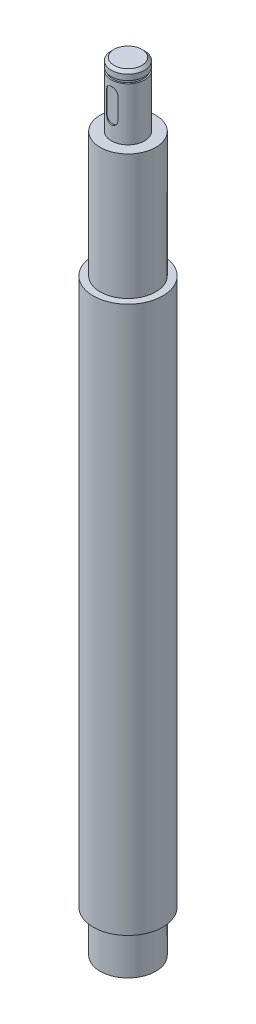
ISO-10303-21;
HEADER;
FILE_DESCRIPTION(('STEP AP214'),'2;1');
FILE_NAME('part.step','',(''),(''),'','','');
FILE_SCHEMA(('AUTOMOTIVE_DESIGN { 1 0 10303 214 1 1 1 1 }'));
ENDSEC;
DATA;
#1=APPLICATION_CONTEXT('core data for automotive mechanical design processes');
#2=APPLICATION_PROTOCOL_DEFINITION('international standard','automotive_design',2000,#1);
#3=PRODUCT_CONTEXT('',#1,'mechanical');
#4=PRODUCT('Part','Part','',(#3));
#5=PRODUCT_RELATED_PRODUCT_CATEGORY('part','',(#4));
#6=PRODUCT_DEFINITION_FORMATION('','',#4);
#7=PRODUCT_DEFINITION_CONTEXT('part definition',#1,'design');
#8=PRODUCT_DEFINITION('design','',#6,#7);
#9=PRODUCT_DEFINITION_SHAPE('','',#8);
#10=(LENGTH_UNIT() NAMED_UNIT(*) SI_UNIT(.MILLI.,.METRE.));
#11=(NAMED_UNIT(*) PLANE_ANGLE_UNIT() SI_UNIT($,.RADIAN.));
#12=(NAMED_UNIT(*) SI_UNIT($,.STERADIAN.) SOLID_ANGLE_UNIT());
#13=UNCERTAINTY_MEASURE_WITH_UNIT(LENGTH_MEASURE(1.E-05),#10,'distance_accuracy_value','');
#14=(GEOMETRIC_REPRESENTATION_CONTEXT(3) GLOBAL_UNCERTAINTY_ASSIGNED_CONTEXT((#13)) GLOBAL_UNIT_ASSIGNED_CONTEXT((#10,
#11,#12)) REPRESENTATION_CONTEXT('',''));
#15=CARTESIAN_POINT('',(0.,0.,0.));
#16=DIRECTION('',(0.,0.,1.));
#17=DIRECTION('',(1.,0.,0.));
#18=AXIS2_PLACEMENT_3D('',#15,#16,#17);
#19=CARTESIAN_POINT('',(0.,264.5,0.));
#20=DIRECTION('',(0.,-1.,0.));
#21=DIRECTION('',(0.,0.,-1.));
#22=AXIS2_PLACEMENT_3D('',#19,#20,#21);
#23=CYLINDRICAL_SURFACE('',#22,6.);
#24=CARTESIAN_POINT('',(0.,260.5,0.));
#25=DIRECTION('',(0.,-1.,0.));
#26=DIRECTION('',(0.,0.,-1.));
#27=AXIS2_PLACEMENT_3D('',#24,#25,#26);
#28=CIRCLE('',#27,6.);
#29=CARTESIAN_POINT('',(0.,260.5,-6.));
#30=VERTEX_POINT('',#29);
#31=EDGE_CURVE('E181',#30,#30,#28,.T.);
#32=ORIENTED_EDGE('',*,*,#31,.T.);
#33=EDGE_LOOP('',(#32));
#34=FACE_BOUND('',#33,.T.);
#35=CARTESIAN_POINT('',(0.,241.5,0.));
#36=DIRECTION('',(0.,1.,0.));
#37=DIRECTION('',(0.,0.,1.));
#38=AXIS2_PLACEMENT_3D('',#35,#36,#37);
#39=CIRCLE('',#38,6.);
#40=CARTESIAN_POINT('',(0.,241.5,6.));
#41=VERTEX_POINT('',#40);
#42=EDGE_CURVE('E106',#41,#41,#39,.T.);
#43=ORIENTED_EDGE('',*,*,#42,.T.);
#44=EDGE_LOOP('',(#43));
#45=FACE_BOUND('',#44,.T.);
#46=CARTESIAN_POINT('',(2.00000000000007,256.5,5.65685424949236));
#47=CARTESIAN_POINT('',(2.00000149491846,256.554580993602,5.65684884188676));
#48=CARTESIAN_POINT('',(1.99776424917485,256.609134124379,5.65764519886488));
#49=CARTESIAN_POINT('',(1.98885121407287,256.71781716811,5.66078654578439));
#50=CARTESIAN_POINT('',(1.98217662286712,256.771947191319,5.66313111768242));
#51=CARTESIAN_POINT('',(1.95562135046165,256.93278428639,5.67238184449299));
#52=CARTESIAN_POINT('',(1.92920846605629,257.038361692541,5.68150584999028));
#53=CARTESIAN_POINT('',(1.85991682366092,257.243250384888,5.70456149397716));
#54=CARTESIAN_POINT('',(1.81704715197512,257.342565093746,5.71849047905857));
#55=CARTESIAN_POINT('',(1.71614645792979,257.532679668011,5.7495757443892));
#56=CARTESIAN_POINT('',(1.65810612564553,257.623474258135,5.76673400456215));
#57=CARTESIAN_POINT('',(1.52610278704609,257.797440462649,5.80308960804093));
#58=CARTESIAN_POINT('',(1.45164996064414,257.880229760925,5.82233755536616));
#59=CARTESIAN_POINT('',(1.28997688598303,258.032412035583,5.86027697385954));
#60=CARTESIAN_POINT('',(1.20275436910913,258.101802626512,5.87896834543704));
#61=CARTESIAN_POINT('',(1.01520729191257,258.226959037608,5.91427765988454));
#62=CARTESIAN_POINT('',(0.914600178717034,258.282321968805,5.93082875123707));
#63=CARTESIAN_POINT('',(0.704858499931747,258.375184503375,5.95939217209316));
#64=CARTESIAN_POINT('',(0.595726551186863,258.412689563641,5.97140588786619));
#65=CARTESIAN_POINT('',(0.376058690956089,258.467471452183,5.98918142285845));
#66=CARTESIAN_POINT('',(0.265703668920239,258.485406545107,5.99514617977147));
#67=CARTESIAN_POINT('',(0.0433979389113599,258.502632597051,6.00087216807634));
#68=CARTESIAN_POINT('',(-0.0685523824907708,258.50192799854,6.00063487762605));
#69=CARTESIAN_POINT('',(-0.286207690558769,258.482311433787,5.99412077270532));
#70=CARTESIAN_POINT('',(-0.391985405251056,258.464114724081,5.98808121982528));
#71=CARTESIAN_POINT('',(-0.598888128753294,258.411213602652,5.97093921001647));
#72=CARTESIAN_POINT('',(-0.70001287923291,258.376508275588,5.95983647235463));
#73=CARTESIAN_POINT('',(-0.896305246061915,258.291157260799,5.93351336542609));
#74=CARTESIAN_POINT('',(-0.991377011307983,258.240307909755,5.91824075676625));
#75=CARTESIAN_POINT('',(-1.17184917819498,258.124280097219,5.88516775360088));
#76=CARTESIAN_POINT('',(-1.25724693942937,258.059097737907,5.86736667195186));
#77=CARTESIAN_POINT('',(-1.42019467942243,257.912657900006,5.83012543885479));
#78=CARTESIAN_POINT('',(-1.4971872232254,257.830788912781,5.81064757359828));
#79=CARTESIAN_POINT('',(-1.63654404964078,257.655117020568,5.77294980945702));
#80=CARTESIAN_POINT('',(-1.69890360636764,257.561310275194,5.75473031831506));
#81=CARTESIAN_POINT('',(-1.80800665118558,257.362639643293,5.72140062752635));
#82=CARTESIAN_POINT('',(-1.85450601901538,257.257632970134,5.70634029896469));
#83=CARTESIAN_POINT('',(-1.92892046140224,257.04070604482,5.68162194124078));
#84=CARTESIAN_POINT('',(-1.95686487211072,256.928797013256,5.67195538817986));
#85=CARTESIAN_POINT('',(-1.98331631256166,256.763162726504,5.6627308418944));
#86=CARTESIAN_POINT('',(-1.98957012251023,256.710717220292,5.66053335389204));
#87=CARTESIAN_POINT('',(-1.99790923214239,256.6055238432,5.65759407142798));
#88=CARTESIAN_POINT('',(-1.99999991078996,256.552776450911,5.65685039859056));
#89=CARTESIAN_POINT('',(-2.,256.5,5.65685424949238));
#90=B_SPLINE_CURVE_WITH_KNOTS('',3,(#46,#47,#48,#49,#50,#51,#52,#53,#54,#55,#56,#57,#58,#59,#60,
#61,#62,#63,#64,#65,#66,#67,#68,#69,#70,#71,#72,#73,#74,#75,#76,#77,#78,#79,#80,#81,#82,#83,#84,
#85,#86,#87,#88,#89),.UNSPECIFIED.,.F.,.F.,(4,2,2,2,2,2,2,2,2,2,2,2,2,2,2,2,2,2,2,2,2,4),(0.,
0.163636969470881,0.327229772338919,0.653162396790757,0.978915321932527,1.30486862627062,
1.64233009925354,1.97985159727498,2.32618265866207,2.6724078224226,3.00658941454812,
3.34069136061291,3.66168836931476,3.98270317816504,4.30794037651945,4.63326613177545,
4.9738810811611,5.31460588498498,5.66036059856092,6.00556734973688,6.16399790665514,
6.32222363058123),.UNSPECIFIED.);
#91=CARTESIAN_POINT('',(2.00000000000003,256.5,5.65685424949237));
#92=VERTEX_POINT('',#91);
#93=CARTESIAN_POINT('',(-2.00000000000003,256.5,5.65685424949237));
#94=VERTEX_POINT('',#93);
#95=EDGE_CURVE('E151',#92,#94,#90,.T.);
#96=ORIENTED_EDGE('',*,*,#95,.F.);
#97=DIRECTION('',(0.,-1.,0.));
#98=VECTOR('',#97,1.);
#99=CARTESIAN_POINT('',(2.00000000000003,264.5,5.65685424949237));
#100=LINE('',#99,#98);
#101=CARTESIAN_POINT('',(2.,248.5,5.65685424949238));
#102=VERTEX_POINT('',#101);
#103=EDGE_CURVE('E61',#102,#92,#100,.F.);
#104=ORIENTED_EDGE('',*,*,#103,.F.);
#105=CARTESIAN_POINT('',(-2.00000000000006,248.5,5.65685424949236));
#106=CARTESIAN_POINT('',(-2.00000149491846,248.445419006398,5.65684884188676));
#107=CARTESIAN_POINT('',(-1.99776424917485,248.390865875621,5.65764519886488));
#108=CARTESIAN_POINT('',(-1.98885121407287,248.28218283189,5.6607865457844));
#109=CARTESIAN_POINT('',(-1.98217662286711,248.228052808681,5.66313111768242));
#110=CARTESIAN_POINT('',(-1.95562135046164,248.06721571361,5.67238184449299));
#111=CARTESIAN_POINT('',(-1.92920846605629,247.961638307459,5.68150584999028));
#112=CARTESIAN_POINT('',(-1.85991682366092,247.756749615112,5.70456149397716));
#113=CARTESIAN_POINT('',(-1.81704715197513,247.657434906254,5.71849047905856));
#114=CARTESIAN_POINT('',(-1.7161464579298,247.467320331989,5.74957574438919));
#115=CARTESIAN_POINT('',(-1.65810612564553,247.376525741865,5.76673400456215));
#116=CARTESIAN_POINT('',(-1.52610278704609,247.202559537351,5.80308960804093));
#117=CARTESIAN_POINT('',(-1.45164996064414,247.119770239075,5.82233755536616));
#118=CARTESIAN_POINT('',(-1.28997688598304,246.967587964417,5.86027697385954));
#119=CARTESIAN_POINT('',(-1.20275436910914,246.898197373488,5.87896834543704));
#120=CARTESIAN_POINT('',(-1.01520729191259,246.773040962392,5.91427765988453));
#121=CARTESIAN_POINT('',(-0.914600178717054,246.717678031195,5.93082875123707));
#122=CARTESIAN_POINT('',(-0.704858499931779,246.624815496625,5.95939217209316));
#123=CARTESIAN_POINT('',(-0.5957265511869,246.587310436359,5.97140588786619));
#124=CARTESIAN_POINT('',(-0.376058690956131,246.532528547817,5.98918142285845));
#125=CARTESIAN_POINT('',(-0.265703668920278,246.514593454893,5.99514617977147));
#126=CARTESIAN_POINT('',(-0.043397938911392,246.497367402949,6.00087216807634));
#127=CARTESIAN_POINT('',(0.0685523824907444,246.49807200146,6.00063487762605));
#128=CARTESIAN_POINT('',(0.286207690558752,246.517688566213,5.99412077270532));
#129=CARTESIAN_POINT('',(0.391985405251043,246.535885275919,5.98808121982528));
#130=CARTESIAN_POINT('',(0.598888128753285,246.588786397348,5.97093921001647));
#131=CARTESIAN_POINT('',(0.700012879232902,246.623491724412,5.95983647235463));
#132=CARTESIAN_POINT('',(0.896305246061903,246.708842739201,5.93351336542609));
#133=CARTESIAN_POINT('',(0.991377011307967,246.759692090245,5.91824075676625));
#134=CARTESIAN_POINT('',(1.17184917819496,246.875719902781,5.88516775360088));
#135=CARTESIAN_POINT('',(1.25724693942936,246.940902262093,5.86736667195187));
#136=CARTESIAN_POINT('',(1.42019467942242,247.087342099994,5.83012543885479));
#137=CARTESIAN_POINT('',(1.49718722322539,247.169211087219,5.81064757359828));
#138=CARTESIAN_POINT('',(1.63654404964076,247.344882979432,5.77294980945703));
#139=CARTESIAN_POINT('',(1.69890360636762,247.438689724806,5.75473031831507));
#140=CARTESIAN_POINT('',(1.80800665118556,247.637360356707,5.72140062752635));
#141=CARTESIAN_POINT('',(1.85450601901536,247.742367029866,5.70634029896469));
#142=CARTESIAN_POINT('',(1.92892046140223,247.95929395518,5.68162194124078));
#143=CARTESIAN_POINT('',(1.95686487211072,248.071202986744,5.67195538817986));
#144=CARTESIAN_POINT('',(1.98331631256166,248.236837273496,5.6627308418944));
#145=CARTESIAN_POINT('',(1.98957012251023,248.289282779708,5.66053335389204));
#146=CARTESIAN_POINT('',(1.9979092321424,248.3944761568,5.65759407142798));
#147=CARTESIAN_POINT('',(1.99999991078996,248.447223549089,5.65685039859056));
#148=CARTESIAN_POINT('',(2.,248.5,5.65685424949238));
#149=B_SPLINE_CURVE_WITH_KNOTS('',3,(#105,#106,#107,#108,#109,#110,#111,#112,#113,#114,#115,
#116,#117,#118,#119,#120,#121,#122,#123,#124,#125,#126,#127,#128,#129,#130,#131,#132,#133,#134,
#135,#136,#137,#138,#139,#140,#141,#142,#143,#144,#145,#146,#147,#148),.UNSPECIFIED.,.F.,.F.,(4,
2,2,2,2,2,2,2,2,2,2,2,2,2,2,2,2,2,2,2,2,4),(0.,0.163636969470881,0.327229772338919,
0.653162396790756,0.978915321932495,1.30486862627063,1.64233009925356,1.97985159727497,
2.32618265866205,2.67240782242257,3.00658941454809,3.3406913606129,3.66168836931477,
3.98270317816502,4.30794037651942,4.63326613177545,4.9738810811611,5.31460588498492,
5.66036059856087,6.00556734973689,6.1639979066551,6.32222363058124),.UNSPECIFIED.);
#150=CARTESIAN_POINT('',(-2.00000000000004,248.5,5.65685424949237));
#151=VERTEX_POINT('',#150);
#152=EDGE_CURVE('E125',#151,#102,#149,.T.);
#153=ORIENTED_EDGE('',*,*,#152,.F.);
#154=DIRECTION('',(0.,-1.,0.));
#155=VECTOR('',#154,1.);
#156=CARTESIAN_POINT('',(-2.00000000000003,264.5,5.65685424949237));
#157=LINE('',#156,#155);
#158=EDGE_CURVE('E108',#94,#151,#157,.T.);
#159=ORIENTED_EDGE('',*,*,#158,.F.);
#160=EDGE_LOOP('',(#96,#104,#153,#159));
#161=FACE_BOUND('',#160,.T.);
#162=ADVANCED_FACE('F37',(#34,#45,#161),#23,.T.);
#163=CARTESIAN_POINT('',(0.,196.5,0.));
#164=DIRECTION('',(0.,-1.,0.));
#165=DIRECTION('',(0.,0.,-1.));
#166=AXIS2_PLACEMENT_3D('',#163,#164,#165);
#167=CYLINDRICAL_SURFACE('',#166,12.5);
#168=CARTESIAN_POINT('',(0.,196.5,0.));
#169=DIRECTION('',(0.,1.,0.));
#170=DIRECTION('',(0.,0.,1.));
#171=AXIS2_PLACEMENT_3D('',#168,#169,#170);
#172=CIRCLE('',#171,12.5);
#173=CARTESIAN_POINT('',(0.,196.5,12.5));
#174=VERTEX_POINT('',#173);
#175=EDGE_CURVE('E119',#174,#174,#172,.T.);
#176=ORIENTED_EDGE('',*,*,#175,.F.);
#177=EDGE_LOOP('',(#176));
#178=FACE_BOUND('',#177,.T.);
#179=CARTESIAN_POINT('',(0.,0.,0.));
#180=DIRECTION('',(0.,1.,0.));
#181=DIRECTION('',(0.,0.,1.));
#182=AXIS2_PLACEMENT_3D('',#179,#180,#181);
#183=CIRCLE('',#182,12.5);
#184=CARTESIAN_POINT('',(0.,0.,12.5));
#185=VERTEX_POINT('',#184);
#186=EDGE_CURVE('E116',#185,#185,#183,.T.);
#187=ORIENTED_EDGE('',*,*,#186,.T.);
#188=EDGE_LOOP('',(#187));
#189=FACE_BOUND('',#188,.T.);
#190=ADVANCED_FACE('F171',(#178,#189),#167,.T.);
#191=CARTESIAN_POINT('',(0.,196.5,0.));
#192=DIRECTION('',(0.,1.,0.));
#193=DIRECTION('',(0.,0.,1.));
#194=AXIS2_PLACEMENT_3D('',#191,#192,#193);
#195=PLANE('',#194);
#196=CARTESIAN_POINT('',(0.,196.5,0.));
#197=DIRECTION('',(0.,1.,0.));
#198=DIRECTION('',(0.,0.,1.));
#199=AXIS2_PLACEMENT_3D('',#196,#197,#198);
#200=CIRCLE('',#199,10.);
#201=CARTESIAN_POINT('',(0.,196.5,-10.));
#202=VERTEX_POINT('',#201);
#203=EDGE_CURVE('E109',#202,#202,#200,.T.);
#204=ORIENTED_EDGE('',*,*,#203,.F.);
#205=EDGE_LOOP('',(#204));
#206=FACE_BOUND('',#205,.T.);
#207=ORIENTED_EDGE('',*,*,#175,.T.);
#208=EDGE_LOOP('',(#207));
#209=FACE_BOUND('',#208,.T.);
#210=ADVANCED_FACE('F176',(#206,#209),#195,.T.);
#211=CARTESIAN_POINT('',(0.,0.,0.));
#212=DIRECTION('',(0.,1.,0.));
#213=DIRECTION('',(0.,0.,1.));
#214=AXIS2_PLACEMENT_3D('',#211,#212,#213);
#215=PLANE('',#214);
#216=CARTESIAN_POINT('',(0.,0.,0.));
#217=DIRECTION('',(0.,-1.,0.));
#218=DIRECTION('',(0.,0.,-1.));
#219=AXIS2_PLACEMENT_3D('',#216,#217,#218);
#220=CIRCLE('',#219,10.);
#221=CARTESIAN_POINT('',(0.,0.,-10.));
#222=VERTEX_POINT('',#221);
#223=EDGE_CURVE('E113',#222,#222,#220,.T.);
#224=ORIENTED_EDGE('',*,*,#223,.F.);
#225=EDGE_LOOP('',(#224));
#226=FACE_BOUND('',#225,.T.);
#227=ORIENTED_EDGE('',*,*,#186,.F.);
#228=EDGE_LOOP('',(#227));
#229=FACE_BOUND('',#228,.T.);
#230=ADVANCED_FACE('F317',(#226,#229),#215,.F.);
#231=CARTESIAN_POINT('',(0.,-15.,0.));
#232=DIRECTION('',(0.,1.,0.));
#233=DIRECTION('',(0.,0.,1.));
#234=AXIS2_PLACEMENT_3D('',#231,#232,#233);
#235=CYLINDRICAL_SURFACE('',#234,10.);
#236=CARTESIAN_POINT('',(0.,-15.,0.));
#237=DIRECTION('',(0.,-1.,0.));
#238=DIRECTION('',(0.,0.,-1.));
#239=AXIS2_PLACEMENT_3D('',#236,#237,#238);
#240=CIRCLE('',#239,10.);
#241=CARTESIAN_POINT('',(0.,-15.,-10.));
#242=VERTEX_POINT('',#241);
#243=EDGE_CURVE('E100',#242,#242,#240,.T.);
#244=ORIENTED_EDGE('',*,*,#243,.F.);
#245=EDGE_LOOP('',(#244));
#246=FACE_BOUND('',#245,.T.);
#247=ORIENTED_EDGE('',*,*,#223,.T.);
#248=EDGE_LOOP('',(#247));
#249=FACE_BOUND('',#248,.T.);
#250=ADVANCED_FACE('F309',(#246,#249),#235,.T.);
#251=CARTESIAN_POINT('',(0.,-15.,0.));
#252=DIRECTION('',(0.,-1.,0.));
#253=DIRECTION('',(0.,0.,-1.));
#254=AXIS2_PLACEMENT_3D('',#251,#252,#253);
#255=PLANE('',#254);
#256=ORIENTED_EDGE('',*,*,#243,.T.);
#257=EDGE_LOOP('',(#256));
#258=FACE_BOUND('',#257,.T.);
#259=ADVANCED_FACE('F300',(#258),#255,.T.);
#260=CARTESIAN_POINT('',(0.,241.5,0.));
#261=DIRECTION('',(0.,-1.,0.));
#262=DIRECTION('',(0.,0.,-1.));
#263=AXIS2_PLACEMENT_3D('',#260,#261,#262);
#264=CYLINDRICAL_SURFACE('',#263,10.);
#265=CARTESIAN_POINT('',(0.,241.5,0.));
#266=DIRECTION('',(0.,1.,0.));
#267=DIRECTION('',(0.,0.,1.));
#268=AXIS2_PLACEMENT_3D('',#265,#266,#267);
#269=CIRCLE('',#268,10.);
#270=CARTESIAN_POINT('',(0.,241.5,-10.));
#271=VERTEX_POINT('',#270);
#272=EDGE_CURVE('E96',#271,#271,#269,.T.);
#273=CARTESIAN_POINT('',(0.,241.5,-10.));
#274=CARTESIAN_POINT('',(0.,241.03125,-10.));
#275=CARTESIAN_POINT('',(0.,240.5625,-10.));
#276=CARTESIAN_POINT('',(0.,239.625,-10.));
#277=CARTESIAN_POINT('',(0.,239.15625,-10.));
#278=CARTESIAN_POINT('',(0.,238.21875,-10.));
#279=CARTESIAN_POINT('',(0.,237.75,-10.));
#280=CARTESIAN_POINT('',(0.,236.8125,-10.));
#281=CARTESIAN_POINT('',(0.,236.34375,-10.));
#282=CARTESIAN_POINT('',(0.,235.40625,-10.));
#283=CARTESIAN_POINT('',(0.,234.9375,-10.));
#284=CARTESIAN_POINT('',(0.,234.,-10.));
#285=CARTESIAN_POINT('',(0.,233.53125,-10.));
#286=CARTESIAN_POINT('',(0.,232.59375,-10.));
#287=CARTESIAN_POINT('',(0.,232.125,-10.));
#288=CARTESIAN_POINT('',(0.,231.1875,-10.));
#289=CARTESIAN_POINT('',(0.,230.71875,-10.));
#290=CARTESIAN_POINT('',(0.,229.78125,-10.));
#291=CARTESIAN_POINT('',(0.,229.3125,-10.));
#292=CARTESIAN_POINT('',(0.,228.375,-10.));
#293=CARTESIAN_POINT('',(0.,227.90625,-10.));
#294=CARTESIAN_POINT('',(0.,226.96875,-10.));
#295=CARTESIAN_POINT('',(0.,226.5,-10.));
#296=CARTESIAN_POINT('',(0.,225.5625,-10.));
#297=CARTESIAN_POINT('',(0.,225.09375,-10.));
#298=CARTESIAN_POINT('',(0.,224.15625,-10.));
#299=CARTESIAN_POINT('',(0.,223.6875,-10.));
#300=CARTESIAN_POINT('',(0.,222.75,-10.));
#301=CARTESIAN_POINT('',(0.,222.28125,-10.));
#302=CARTESIAN_POINT('',(0.,221.34375,-10.));
#303=CARTESIAN_POINT('',(0.,220.875,-10.));
#304=CARTESIAN_POINT('',(0.,219.9375,-10.));
#305=CARTESIAN_POINT('',(0.,219.46875,-10.));
#306=CARTESIAN_POINT('',(0.,218.53125,-10.));
#307=CARTESIAN_POINT('',(0.,218.0625,-10.));
#308=CARTESIAN_POINT('',(0.,217.125,-10.));
#309=CARTESIAN_POINT('',(0.,216.65625,-10.));
#310=CARTESIAN_POINT('',(0.,215.71875,-10.));
#311=CARTESIAN_POINT('',(0.,215.25,-10.));
#312=CARTESIAN_POINT('',(0.,214.3125,-10.));
#313=CARTESIAN_POINT('',(0.,213.84375,-10.));
#314=CARTESIAN_POINT('',(0.,212.90625,-10.));
#315=CARTESIAN_POINT('',(0.,212.4375,-10.));
#316=CARTESIAN_POINT('',(0.,211.5,-10.));
#317=CARTESIAN_POINT('',(0.,211.03125,-10.));
#318=CARTESIAN_POINT('',(0.,210.09375,-10.));
#319=CARTESIAN_POINT('',(0.,209.625,-10.));
#320=CARTESIAN_POINT('',(0.,208.6875,-10.));
#321=CARTESIAN_POINT('',(0.,208.21875,-10.));
#322=CARTESIAN_POINT('',(0.,207.28125,-10.));
#323=CARTESIAN_POINT('',(0.,206.8125,-10.));
#324=CARTESIAN_POINT('',(0.,205.875,-10.));
#325=CARTESIAN_POINT('',(0.,205.40625,-10.));
#326=CARTESIAN_POINT('',(0.,204.46875,-10.));
#327=CARTESIAN_POINT('',(0.,204.,-10.));
#328=CARTESIAN_POINT('',(0.,203.0625,-10.));
#329=CARTESIAN_POINT('',(0.,202.59375,-10.));
#330=CARTESIAN_POINT('',(0.,201.65625,-10.));
#331=CARTESIAN_POINT('',(0.,201.1875,-10.));
#332=CARTESIAN_POINT('',(0.,200.25,-10.));
#333=CARTESIAN_POINT('',(0.,199.78125,-10.));
#334=CARTESIAN_POINT('',(0.,198.84375,-10.));
#335=CARTESIAN_POINT('',(0.,198.375,-10.));
#336=CARTESIAN_POINT('',(0.,197.4375,-10.));
#337=CARTESIAN_POINT('',(0.,196.96875,-10.));
#338=CARTESIAN_POINT('',(0.,196.5,-10.));
#339=B_SPLINE_CURVE_WITH_KNOTS('',3,(#273,#274,#275,#276,#277,#278,#279,#280,#281,#282,#283,
#284,#285,#286,#287,#288,#289,#290,#291,#292,#293,#294,#295,#296,#297,#298,#299,#300,#301,#302,
#303,#304,#305,#306,#307,#308,#309,#310,#311,#312,#313,#314,#315,#316,#317,#318,#319,#320,#321,
#322,#323,#324,#325,#326,#327,#328,#329,#330,#331,#332,#333,#334,#335,#336,#337,#338),
.UNSPECIFIED.,.F.,.F.,(4,2,2,2,2,2,2,2,2,2,2,2,2,2,2,2,2,2,2,2,2,2,2,2,2,2,2,2,2,2,2,2,4),(0.,
1.40625,2.8125,4.21874999999999,5.62499999999999,7.03124999999999,8.43749999999999,
9.84374999999998,11.25,12.65625,14.0625,15.46875,16.875,18.28125,19.6875,21.09375,22.5,23.90625,
25.3125,26.71875,28.125,29.53125,30.9375,32.34375,33.75,35.15625,36.5625,37.96875,39.375,
40.78125,42.1875,43.59375,45.),.UNSPECIFIED.);
#340=EDGE_CURVE('BSEAM294',#271,#202,#339,.T.);
#341=ORIENTED_EDGE('',*,*,#272,.F.);
#342=ORIENTED_EDGE('',*,*,#203,.T.);
#343=ORIENTED_EDGE('',*,*,#340,.T.);
#344=ORIENTED_EDGE('',*,*,#340,.F.);
#345=EDGE_LOOP('',(#341,#343,#342,#344));
#346=FACE_BOUND('',#345,.T.);
#347=ADVANCED_FACE('F294',(#346),#264,.T.);
#348=CARTESIAN_POINT('',(0.,241.5,0.));
#349=DIRECTION('',(0.,1.,0.));
#350=DIRECTION('',(0.,0.,1.));
#351=AXIS2_PLACEMENT_3D('',#348,#349,#350);
#352=PLANE('',#351);
#353=ORIENTED_EDGE('',*,*,#42,.F.);
#354=EDGE_LOOP('',(#353));
#355=FACE_BOUND('',#354,.T.);
#356=ORIENTED_EDGE('',*,*,#272,.T.);
#357=EDGE_LOOP('',(#356));
#358=FACE_BOUND('',#357,.T.);
#359=ADVANCED_FACE('F149',(#355,#358),#352,.T.);
#360=CARTESIAN_POINT('',(0.,256.5,5.5));
#361=DIRECTION('',(0.,0.,1.));
#362=DIRECTION('',(1.,0.,0.));
#363=AXIS2_PLACEMENT_3D('',#360,#361,#362);
#364=CYLINDRICAL_SURFACE('',#363,2.00000000000003);
#365=ORIENTED_EDGE('',*,*,#95,.T.);
#366=DIRECTION('',(0.,0.,1.));
#367=VECTOR('',#366,1.);
#368=CARTESIAN_POINT('',(-2.00000000000003,256.5,5.5));
#369=LINE('',#368,#367);
#370=CARTESIAN_POINT('',(-2.00000000000003,256.5,5.5));
#371=VERTEX_POINT('',#370);
#372=EDGE_CURVE('E53',#371,#94,#369,.T.);
#373=ORIENTED_EDGE('',*,*,#372,.F.);
#374=CARTESIAN_POINT('',(0.,256.5,5.5));
#375=DIRECTION('',(0.,0.,-1.));
#376=DIRECTION('',(-1.,0.,0.));
#377=AXIS2_PLACEMENT_3D('',#374,#375,#376);
#378=CIRCLE('',#377,2.00000000000003);
#379=CARTESIAN_POINT('',(2.00000000000003,256.5,5.5));
#380=VERTEX_POINT('',#379);
#381=EDGE_CURVE('E85',#371,#380,#378,.T.);
#382=ORIENTED_EDGE('',*,*,#381,.T.);
#383=DIRECTION('',(0.,0.,1.));
#384=VECTOR('',#383,1.);
#385=CARTESIAN_POINT('',(2.00000000000003,256.5,5.5));
#386=LINE('',#385,#384);
#387=EDGE_CURVE('E91',#380,#92,#386,.T.);
#388=ORIENTED_EDGE('',*,*,#387,.T.);
#389=EDGE_LOOP('',(#365,#373,#382,#388));
#390=FACE_BOUND('',#389,.T.);
#391=ADVANCED_FACE('F90',(#390),#364,.F.);
#392=CARTESIAN_POINT('',(2.00000000000003,256.5,5.5));
#393=DIRECTION('',(-1.,0.,0.));
#394=DIRECTION('',(0.,0.,1.));
#395=AXIS2_PLACEMENT_3D('',#392,#393,#394);
#396=PLANE('',#395);
#397=ORIENTED_EDGE('',*,*,#103,.T.);
#398=ORIENTED_EDGE('',*,*,#387,.F.);
#399=DIRECTION('',(0.,-1.,0.));
#400=VECTOR('',#399,1.);
#401=CARTESIAN_POINT('',(2.00000000000003,256.5,5.5));
#402=LINE('',#401,#400);
#403=CARTESIAN_POINT('',(2.,248.5,5.5));
#404=VERTEX_POINT('',#403);
#405=EDGE_CURVE('E81',#380,#404,#402,.T.);
#406=ORIENTED_EDGE('',*,*,#405,.T.);
#407=DIRECTION('',(0.,0.,1.));
#408=VECTOR('',#407,1.);
#409=CARTESIAN_POINT('',(2.,248.5,5.5));
#410=LINE('',#409,#408);
#411=EDGE_CURVE('E97',#404,#102,#410,.T.);
#412=ORIENTED_EDGE('',*,*,#411,.T.);
#413=EDGE_LOOP('',(#397,#398,#406,#412));
#414=FACE_BOUND('',#413,.T.);
#415=ADVANCED_FACE('F95',(#414),#396,.T.);
#416=CARTESIAN_POINT('',(0.,248.5,5.5));
#417=DIRECTION('',(0.,0.,1.));
#418=DIRECTION('',(1.,0.,0.));
#419=AXIS2_PLACEMENT_3D('',#416,#417,#418);
#420=CYLINDRICAL_SURFACE('',#419,2.00000000000003);
#421=ORIENTED_EDGE('',*,*,#152,.T.);
#422=ORIENTED_EDGE('',*,*,#411,.F.);
#423=CARTESIAN_POINT('',(0.,248.5,5.5));
#424=DIRECTION('',(0.,0.,-1.));
#425=DIRECTION('',(-1.,0.,0.));
#426=AXIS2_PLACEMENT_3D('',#423,#424,#425);
#427=CIRCLE('',#426,2.00000000000003);
#428=CARTESIAN_POINT('',(-2.00000000000004,248.5,5.5));
#429=VERTEX_POINT('',#428);
#430=EDGE_CURVE('E86',#404,#429,#427,.T.);
#431=ORIENTED_EDGE('',*,*,#430,.T.);
#432=DIRECTION('',(0.,0.,1.));
#433=VECTOR('',#432,1.);
#434=CARTESIAN_POINT('',(-2.00000000000004,248.5,5.5));
#435=LINE('',#434,#433);
#436=EDGE_CURVE('E102',#429,#151,#435,.T.);
#437=ORIENTED_EDGE('',*,*,#436,.T.);
#438=EDGE_LOOP('',(#421,#422,#431,#437));
#439=FACE_BOUND('',#438,.T.);
#440=ADVANCED_FACE('F137',(#439),#420,.F.);
#441=CARTESIAN_POINT('',(-2.00000000000003,256.5,5.5));
#442=DIRECTION('',(1.,0.,0.));
#443=DIRECTION('',(0.,1.,0.));
#444=AXIS2_PLACEMENT_3D('',#441,#442,#443);
#445=PLANE('',#444);
#446=ORIENTED_EDGE('',*,*,#158,.T.);
#447=ORIENTED_EDGE('',*,*,#436,.F.);
#448=DIRECTION('',(0.,1.,0.));
#449=VECTOR('',#448,1.);
#450=CARTESIAN_POINT('',(-2.00000000000003,256.5,5.5));
#451=LINE('',#450,#449);
#452=EDGE_CURVE('E188',#429,#371,#451,.T.);
#453=ORIENTED_EDGE('',*,*,#452,.T.);
#454=ORIENTED_EDGE('',*,*,#372,.T.);
#455=EDGE_LOOP('',(#446,#447,#453,#454));
#456=FACE_BOUND('',#455,.T.);
#457=ADVANCED_FACE('F142',(#456),#445,.T.);
#458=CARTESIAN_POINT('',(0.,256.5,5.5));
#459=DIRECTION('',(0.,0.,-1.));
#460=DIRECTION('',(-1.,0.,0.));
#461=AXIS2_PLACEMENT_3D('',#458,#459,#460);
#462=PLANE('',#461);
#463=ORIENTED_EDGE('',*,*,#381,.F.);
#464=ORIENTED_EDGE('',*,*,#452,.F.);
#465=ORIENTED_EDGE('',*,*,#430,.F.);
#466=ORIENTED_EDGE('',*,*,#405,.F.);
#467=EDGE_LOOP('',(#463,#464,#465,#466));
#468=FACE_BOUND('',#467,.T.);
#469=ADVANCED_FACE('F83',(#468),#462,.F.);
#470=CARTESIAN_POINT('',(0.,261.5,-6.));
#471=DIRECTION('',(0.,1.,0.));
#472=DIRECTION('',(0.,0.,1.));
#473=AXIS2_PLACEMENT_3D('',#470,#471,#472);
#474=PLANE('',#473);
#475=CARTESIAN_POINT('',(0.,261.5,0.));
#476=DIRECTION('',(0.,-1.,0.));
#477=DIRECTION('',(0.,0.,-1.));
#478=AXIS2_PLACEMENT_3D('',#475,#476,#477);
#479=CIRCLE('',#478,5.5);
#480=CARTESIAN_POINT('',(0.,261.5,-5.5));
#481=VERTEX_POINT('',#480);
#482=EDGE_CURVE('E195',#481,#481,#479,.T.);
#483=ORIENTED_EDGE('',*,*,#482,.F.);
#484=EDGE_LOOP('',(#483));
#485=FACE_BOUND('',#484,.T.);
#486=CARTESIAN_POINT('',(0.,261.5,0.));
#487=DIRECTION('',(0.,-1.,0.));
#488=DIRECTION('',(0.,0.,-1.));
#489=AXIS2_PLACEMENT_3D('',#486,#487,#488);
#490=CIRCLE('',#489,6.);
#491=CARTESIAN_POINT('',(0.,261.5,-6.));
#492=VERTEX_POINT('',#491);
#493=EDGE_CURVE('E93',#492,#492,#490,.T.);
#494=ORIENTED_EDGE('',*,*,#493,.T.);
#495=EDGE_LOOP('',(#494));
#496=FACE_BOUND('',#495,.T.);
#497=ADVANCED_FACE('F207',(#485,#496),#474,.F.);
#498=CARTESIAN_POINT('',(0.,264.5,0.));
#499=DIRECTION('',(0.,-1.,0.));
#500=DIRECTION('',(0.,0.,-1.));
#501=AXIS2_PLACEMENT_3D('',#498,#499,#500);
#502=CYLINDRICAL_SURFACE('',#501,5.5);
#503=CARTESIAN_POINT('',(0.,260.5,0.));
#504=DIRECTION('',(0.,-1.,0.));
#505=DIRECTION('',(0.,0.,-1.));
#506=AXIS2_PLACEMENT_3D('',#503,#504,#505);
#507=CIRCLE('',#506,5.5);
#508=CARTESIAN_POINT('',(0.,260.5,-5.5));
#509=VERTEX_POINT('',#508);
#510=EDGE_CURVE('E198',#509,#509,#507,.T.);
#511=ORIENTED_EDGE('',*,*,#510,.F.);
#512=EDGE_LOOP('',(#511));
#513=FACE_BOUND('',#512,.T.);
#514=ORIENTED_EDGE('',*,*,#482,.T.);
#515=EDGE_LOOP('',(#514));
#516=FACE_BOUND('',#515,.T.);
#517=ADVANCED_FACE('F204',(#513,#516),#502,.T.);
#518=CARTESIAN_POINT('',(0.,260.5,-6.));
#519=DIRECTION('',(0.,-1.,0.));
#520=DIRECTION('',(0.,0.,-1.));
#521=AXIS2_PLACEMENT_3D('',#518,#519,#520);
#522=PLANE('',#521);
#523=ORIENTED_EDGE('',*,*,#31,.F.);
#524=EDGE_LOOP('',(#523));
#525=FACE_BOUND('',#524,.T.);
#526=ORIENTED_EDGE('',*,*,#510,.T.);
#527=EDGE_LOOP('',(#526));
#528=FACE_BOUND('',#527,.T.);
#529=ADVANCED_FACE('F168',(#525,#528),#522,.F.);
#530=CARTESIAN_POINT('',(0.,264.5,0.));
#531=DIRECTION('',(0.,1.,0.));
#532=DIRECTION('',(0.,0.,1.));
#533=AXIS2_PLACEMENT_3D('',#530,#531,#532);
#534=PLANE('',#533);
#535=CARTESIAN_POINT('',(0.,264.5,0.));
#536=DIRECTION('',(0.,1.,0.));
#537=DIRECTION('',(0.,0.,1.));
#538=AXIS2_PLACEMENT_3D('',#535,#536,#537);
#539=CIRCLE('',#538,4.99999999999998);
#540=CARTESIAN_POINT('',(0.,264.5,4.99999999999998));
#541=VERTEX_POINT('',#540);
#542=EDGE_CURVE('E46',#541,#541,#539,.T.);
#543=ORIENTED_EDGE('',*,*,#542,.T.);
#544=EDGE_LOOP('',(#543));
#545=FACE_BOUND('',#544,.T.);
#546=ADVANCED_FACE('F150',(#545),#534,.T.);
#547=CARTESIAN_POINT('',(0.,264.5,0.));
#548=DIRECTION('',(0.,-1.,0.));
#549=DIRECTION('',(0.,0.,-1.));
#550=AXIS2_PLACEMENT_3D('',#547,#548,#549);
#551=CONICAL_SURFACE('',#550,4.99999999999998,0.785398163397432);
#552=CARTESIAN_POINT('',(0.,263.5,0.));
#553=DIRECTION('',(0.,1.,0.));
#554=DIRECTION('',(0.,0.,1.));
#555=AXIS2_PLACEMENT_3D('',#552,#553,#554);
#556=CIRCLE('',#555,6.);
#557=CARTESIAN_POINT('',(0.,263.5,6.));
#558=VERTEX_POINT('',#557);
#559=EDGE_CURVE('E11',#558,#558,#556,.F.);
#560=ORIENTED_EDGE('',*,*,#559,.F.);
#561=EDGE_LOOP('',(#560));
#562=FACE_BOUND('',#561,.T.);
#563=ORIENTED_EDGE('',*,*,#542,.F.);
#564=EDGE_LOOP('',(#563));
#565=FACE_BOUND('',#564,.T.);
#566=ADVANCED_FACE('F40',(#562,#565),#551,.T.);
#567=ORIENTED_EDGE('',*,*,#493,.F.);
#568=EDGE_LOOP('',(#567));
#569=FACE_BOUND('',#568,.T.);
#570=ORIENTED_EDGE('',*,*,#559,.T.);
#571=EDGE_LOOP('',(#570));
#572=FACE_BOUND('',#571,.T.);
#573=ADVANCED_FACE('F161',(#569,#572),#23,.T.);
#574=CLOSED_SHELL('',(#162,#190,#210,#230,#250,#259,#347,#359,#391,#415,#440,#457,#469,#497,
#517,#529,#546,#566,#573));
#575=MANIFOLD_SOLID_BREP('B2',#574);
#576=ADVANCED_BREP_SHAPE_REPRESENTATION('',(#18,#575),#14);
#577=SHAPE_DEFINITION_REPRESENTATION(#9,#576);
ENDSEC;
END-ISO-10303-21;
